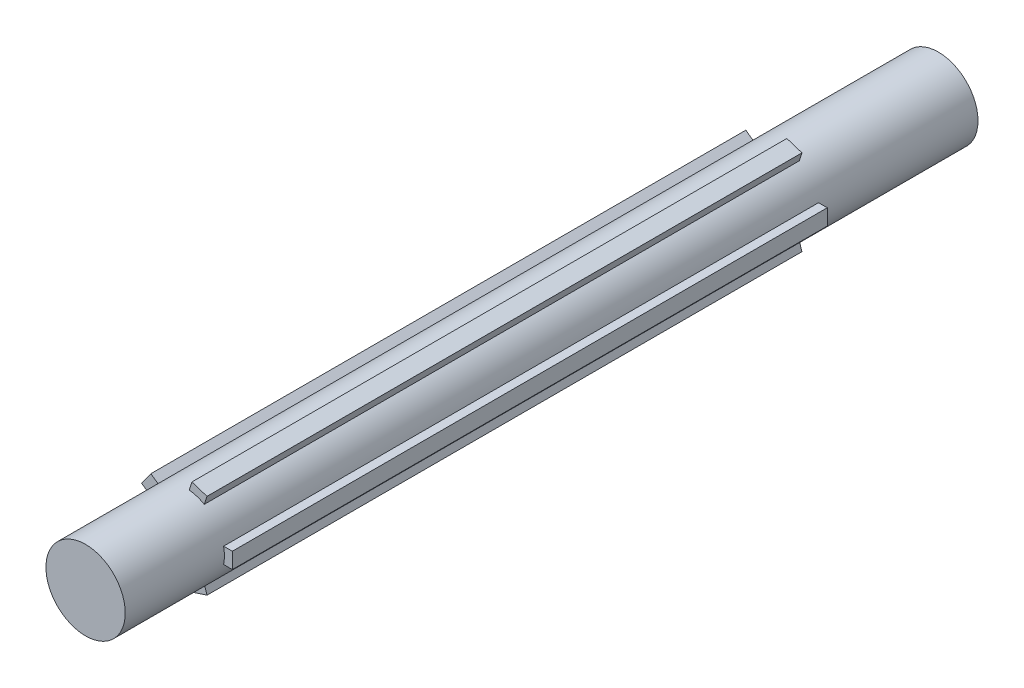
ISO-10303-21;
HEADER;
FILE_DESCRIPTION(('STEP AP214'),'2;1');
FILE_NAME('part.step','',(''),(''),'','','');
FILE_SCHEMA(('AUTOMOTIVE_DESIGN { 1 0 10303 214 1 1 1 1 }'));
ENDSEC;
DATA;
#1=APPLICATION_CONTEXT('core data for automotive mechanical design processes');
#2=APPLICATION_PROTOCOL_DEFINITION('international standard','automotive_design',2000,#1);
#3=PRODUCT_CONTEXT('',#1,'mechanical');
#4=PRODUCT('Part','Part','',(#3));
#5=PRODUCT_RELATED_PRODUCT_CATEGORY('part','',(#4));
#6=PRODUCT_DEFINITION_FORMATION('','',#4);
#7=PRODUCT_DEFINITION_CONTEXT('part definition',#1,'design');
#8=PRODUCT_DEFINITION('design','',#6,#7);
#9=PRODUCT_DEFINITION_SHAPE('','',#8);
#10=(LENGTH_UNIT() NAMED_UNIT(*) SI_UNIT(.MILLI.,.METRE.));
#11=(NAMED_UNIT(*) PLANE_ANGLE_UNIT() SI_UNIT($,.RADIAN.));
#12=(NAMED_UNIT(*) SI_UNIT($,.STERADIAN.) SOLID_ANGLE_UNIT());
#13=UNCERTAINTY_MEASURE_WITH_UNIT(LENGTH_MEASURE(1.E-05),#10,'distance_accuracy_value','');
#14=(GEOMETRIC_REPRESENTATION_CONTEXT(3) GLOBAL_UNCERTAINTY_ASSIGNED_CONTEXT((#13)) GLOBAL_UNIT_ASSIGNED_CONTEXT((#10,
#11,#12)) REPRESENTATION_CONTEXT('',''));
#15=CARTESIAN_POINT('',(0.,0.,0.));
#16=DIRECTION('',(0.,0.,1.));
#17=DIRECTION('',(1.,0.,0.));
#18=AXIS2_PLACEMENT_3D('',#15,#16,#17);
#19=CARTESIAN_POINT('',(0.,0.,-150.));
#20=DIRECTION('',(0.,0.,1.));
#21=DIRECTION('',(1.,0.,0.));
#22=AXIS2_PLACEMENT_3D('',#19,#20,#21);
#23=PLANE('',#22);
#24=CARTESIAN_POINT('',(0.,0.,-150.));
#25=DIRECTION('',(0.,0.,-1.));
#26=DIRECTION('',(-1.,0.,0.));
#27=AXIS2_PLACEMENT_3D('',#24,#25,#26);
#28=CIRCLE('',#27,10.);
#29=CARTESIAN_POINT('',(-9.10228582241994,4.1410617970483,-150.));
#30=VERTEX_POINT('',#29);
#31=CARTESIAN_POINT('',(-6.75114481325018,7.37712977454818,-150.));
#32=VERTEX_POINT('',#31);
#33=EDGE_CURVE('E56',#30,#32,#28,.T.);
#34=ORIENTED_EDGE('',*,*,#33,.F.);
#35=DIRECTION('',(-0.809016994374947,0.587785252292473,0.));
#36=VECTOR('',#35,1.);
#37=CARTESIAN_POINT('',(-9.10228582241994,4.1410617970483,-150.));
#38=LINE('',#37,#36);
#39=CARTESIAN_POINT('',(-10.8837744370843,5.43538903875934,-150.));
#40=VERTEX_POINT('',#39);
#41=EDGE_CURVE('E381',#30,#40,#38,.T.);
#42=ORIENTED_EDGE('',*,*,#41,.T.);
#43=DIRECTION('',(0.587785252292473,0.809016994374948,0.));
#44=VECTOR('',#43,1.);
#45=CARTESIAN_POINT('',(-10.8837744370843,5.43538903875934,-150.));
#46=LINE('',#45,#44);
#47=CARTESIAN_POINT('',(-8.53263342791446,8.67145701625913,-150.));
#48=VERTEX_POINT('',#47);
#49=EDGE_CURVE('E389',#40,#48,#46,.T.);
#50=ORIENTED_EDGE('',*,*,#49,.T.);
#51=DIRECTION('',(-0.809016994374947,0.587785252292473,0.));
#52=VECTOR('',#51,1.);
#53=CARTESIAN_POINT('',(-6.75114481325018,7.37712977454818,-150.));
#54=LINE('',#53,#52);
#55=EDGE_CURVE('E392',#32,#48,#54,.T.);
#56=ORIENTED_EDGE('',*,*,#55,.F.);
#57=EDGE_LOOP('',(#34,#42,#50,#56));
#58=FACE_BOUND('',#57,.T.);
#59=ADVANCED_FACE('F43',(#58),#23,.F.);
#60=CARTESIAN_POINT('',(1.12562279967807,9.93644671463823,-150.));
#61=VERTEX_POINT('',#60);
#62=CARTESIAN_POINT('',(4.9298488648587,8.70037873713848,-150.));
#63=VERTEX_POINT('',#62);
#64=EDGE_CURVE('E11',#61,#63,#28,.T.);
#65=ORIENTED_EDGE('',*,*,#64,.F.);
#66=DIRECTION('',(0.309016994374947,0.951056516295154,0.));
#67=VECTOR('',#66,1.);
#68=CARTESIAN_POINT('',(1.12562279967807,9.93644671463823,-150.));
#69=LINE('',#68,#67);
#70=CARTESIAN_POINT('',(1.80609089990889,12.0307121842915,-150.));
#71=VERTEX_POINT('',#70);
#72=EDGE_CURVE('E179',#61,#71,#69,.T.);
#73=ORIENTED_EDGE('',*,*,#72,.T.);
#74=DIRECTION('',(0.951056516295154,-0.309016994374947,0.));
#75=VECTOR('',#74,1.);
#76=CARTESIAN_POINT('',(1.80609089990889,12.0307121842915,-150.));
#77=LINE('',#76,#75);
#78=CARTESIAN_POINT('',(5.6103169650895,10.7946442067917,-150.));
#79=VERTEX_POINT('',#78);
#80=EDGE_CURVE('E171',#71,#79,#77,.T.);
#81=ORIENTED_EDGE('',*,*,#80,.T.);
#82=DIRECTION('',(0.309016994374947,0.951056516295154,0.));
#83=VECTOR('',#82,1.);
#84=CARTESIAN_POINT('',(4.9298488648587,8.70037873713848,-150.));
#85=LINE('',#84,#83);
#86=EDGE_CURVE('E177',#63,#79,#85,.T.);
#87=ORIENTED_EDGE('',*,*,#86,.F.);
#88=EDGE_LOOP('',(#65,#73,#81,#87));
#89=FACE_BOUND('',#88,.T.);
#90=ADVANCED_FACE('F174',(#89),#23,.F.);
#91=CARTESIAN_POINT('',(9.79795897113271,2.,-150.));
#92=VERTEX_POINT('',#91);
#93=CARTESIAN_POINT('',(9.79795897113271,-2.,-150.));
#94=VERTEX_POINT('',#93);
#95=EDGE_CURVE('E54',#92,#94,#28,.T.);
#96=ORIENTED_EDGE('',*,*,#95,.F.);
#97=DIRECTION('',(1.,0.,0.));
#98=VECTOR('',#97,1.);
#99=CARTESIAN_POINT('',(9.79795897113271,2.,-150.));
#100=LINE('',#99,#98);
#101=CARTESIAN_POINT('',(12.,2.,-150.));
#102=VERTEX_POINT('',#101);
#103=EDGE_CURVE('E201',#92,#102,#100,.T.);
#104=ORIENTED_EDGE('',*,*,#103,.T.);
#105=DIRECTION('',(0.,-1.,0.));
#106=VECTOR('',#105,1.);
#107=CARTESIAN_POINT('',(12.,2.,-150.));
#108=LINE('',#107,#106);
#109=CARTESIAN_POINT('',(12.,-2.,-150.));
#110=VERTEX_POINT('',#109);
#111=EDGE_CURVE('E64',#102,#110,#108,.T.);
#112=ORIENTED_EDGE('',*,*,#111,.T.);
#113=DIRECTION('',(1.,0.,0.));
#114=VECTOR('',#113,1.);
#115=CARTESIAN_POINT('',(9.79795897113271,-2.,-150.));
#116=LINE('',#115,#114);
#117=EDGE_CURVE('E209',#94,#110,#116,.T.);
#118=ORIENTED_EDGE('',*,*,#117,.F.);
#119=EDGE_LOOP('',(#96,#104,#112,#118));
#120=FACE_BOUND('',#119,.T.);
#121=ADVANCED_FACE('F438',(#120),#23,.F.);
#122=CARTESIAN_POINT('',(4.92984886485898,-8.70037873713832,-150.));
#123=VERTEX_POINT('',#122);
#124=CARTESIAN_POINT('',(1.12562279967839,-9.9364467146382,-150.));
#125=VERTEX_POINT('',#124);
#126=EDGE_CURVE('E346',#123,#125,#28,.T.);
#127=ORIENTED_EDGE('',*,*,#126,.F.);
#128=DIRECTION('',(0.309016994374947,-0.951056516295154,0.));
#129=VECTOR('',#128,1.);
#130=CARTESIAN_POINT('',(4.92984886485898,-8.70037873713832,-150.));
#131=LINE('',#130,#129);
#132=CARTESIAN_POINT('',(5.61031696508993,-10.7946442067921,-150.));
#133=VERTEX_POINT('',#132);
#134=EDGE_CURVE('E265',#123,#133,#131,.T.);
#135=ORIENTED_EDGE('',*,*,#134,.T.);
#136=DIRECTION('',(-0.951056516295154,-0.309016994374947,0.));
#137=VECTOR('',#136,1.);
#138=CARTESIAN_POINT('',(5.61031696508993,-10.7946442067921,-150.));
#139=LINE('',#138,#137);
#140=CARTESIAN_POINT('',(1.80609089990932,-12.0307121842918,-150.));
#141=VERTEX_POINT('',#140);
#142=EDGE_CURVE('E144',#133,#141,#139,.T.);
#143=ORIENTED_EDGE('',*,*,#142,.T.);
#144=DIRECTION('',(0.309016994374947,-0.951056516295154,0.));
#145=VECTOR('',#144,1.);
#146=CARTESIAN_POINT('',(1.12562279967839,-9.93644671463819,-150.));
#147=LINE('',#146,#145);
#148=EDGE_CURVE('E383',#125,#141,#147,.T.);
#149=ORIENTED_EDGE('',*,*,#148,.F.);
#150=EDGE_LOOP('',(#127,#135,#143,#149));
#151=FACE_BOUND('',#150,.T.);
#152=ADVANCED_FACE('F440',(#151),#23,.F.);
#153=CARTESIAN_POINT('',(-6.75114481324956,-7.37712977454874,-150.));
#154=VERTEX_POINT('',#153);
#155=CARTESIAN_POINT('',(-9.1022858224196,-4.14106179704906,-150.));
#156=VERTEX_POINT('',#155);
#157=EDGE_CURVE('E340',#154,#156,#28,.T.);
#158=ORIENTED_EDGE('',*,*,#157,.F.);
#159=DIRECTION('',(-0.809016994374947,-0.587785252292473,0.));
#160=VECTOR('',#159,1.);
#161=CARTESIAN_POINT('',(-6.75114481324956,-7.37712977454874,-150.));
#162=LINE('',#161,#160);
#163=CARTESIAN_POINT('',(-8.53263342791419,-8.67145701625995,-150.));
#164=VERTEX_POINT('',#163);
#165=EDGE_CURVE('E377',#154,#164,#162,.T.);
#166=ORIENTED_EDGE('',*,*,#165,.T.);
#167=DIRECTION('',(-0.587785252292473,0.809016994374947,0.));
#168=VECTOR('',#167,1.);
#169=CARTESIAN_POINT('',(-8.53263342791419,-8.67145701625995,-150.));
#170=LINE('',#169,#168);
#171=CARTESIAN_POINT('',(-10.8837744370841,-5.43538903876016,-150.));
#172=VERTEX_POINT('',#171);
#173=EDGE_CURVE('E371',#164,#172,#170,.T.);
#174=ORIENTED_EDGE('',*,*,#173,.T.);
#175=DIRECTION('',(-0.809016994374947,-0.587785252292473,0.));
#176=VECTOR('',#175,1.);
#177=CARTESIAN_POINT('',(-9.10228582241959,-4.14106179704906,-150.));
#178=LINE('',#177,#176);
#179=EDGE_CURVE('E376',#156,#172,#178,.T.);
#180=ORIENTED_EDGE('',*,*,#179,.F.);
#181=EDGE_LOOP('',(#158,#166,#174,#180));
#182=FACE_BOUND('',#181,.T.);
#183=ADVANCED_FACE('F446',(#182),#23,.F.);
#184=CARTESIAN_POINT('',(0.,0.,0.));
#185=DIRECTION('',(0.,0.,1.));
#186=DIRECTION('',(1.,0.,0.));
#187=AXIS2_PLACEMENT_3D('',#184,#185,#186);
#188=PLANE('',#187);
#189=CARTESIAN_POINT('',(0.,0.,0.));
#190=DIRECTION('',(0.,0.,1.));
#191=DIRECTION('',(1.,0.,0.));
#192=AXIS2_PLACEMENT_3D('',#189,#190,#191);
#193=CIRCLE('',#192,10.);
#194=CARTESIAN_POINT('',(4.9298488648587,8.70037873713848,0.));
#195=VERTEX_POINT('',#194);
#196=CARTESIAN_POINT('',(1.12562279967807,9.93644671463823,0.));
#197=VERTEX_POINT('',#196);
#198=EDGE_CURVE('E330',#195,#197,#193,.T.);
#199=ORIENTED_EDGE('',*,*,#198,.F.);
#200=DIRECTION('',(0.309016994374947,0.951056516295154,0.));
#201=VECTOR('',#200,1.);
#202=CARTESIAN_POINT('',(4.9298488648587,8.70037873713848,0.));
#203=LINE('',#202,#201);
#204=CARTESIAN_POINT('',(5.6103169650895,10.7946442067917,0.));
#205=VERTEX_POINT('',#204);
#206=EDGE_CURVE('E252',#195,#205,#203,.T.);
#207=ORIENTED_EDGE('',*,*,#206,.T.);
#208=DIRECTION('',(0.951056516295154,-0.309016994374947,0.));
#209=VECTOR('',#208,1.);
#210=CARTESIAN_POINT('',(1.80609089990889,12.0307121842915,0.));
#211=LINE('',#210,#209);
#212=CARTESIAN_POINT('',(1.80609089990889,12.0307121842915,0.));
#213=VERTEX_POINT('',#212);
#214=EDGE_CURVE('E189',#213,#205,#211,.T.);
#215=ORIENTED_EDGE('',*,*,#214,.F.);
#216=DIRECTION('',(0.309016994374947,0.951056516295154,0.));
#217=VECTOR('',#216,1.);
#218=CARTESIAN_POINT('',(1.12562279967807,9.93644671463823,0.));
#219=LINE('',#218,#217);
#220=EDGE_CURVE('E247',#197,#213,#219,.T.);
#221=ORIENTED_EDGE('',*,*,#220,.F.);
#222=EDGE_LOOP('',(#199,#207,#215,#221));
#223=FACE_BOUND('',#222,.T.);
#224=ADVANCED_FACE('F454',(#223),#188,.T.);
#225=CARTESIAN_POINT('',(-6.75114481325018,7.37712977454818,0.));
#226=VERTEX_POINT('',#225);
#227=CARTESIAN_POINT('',(-9.10228582241994,4.1410617970483,0.));
#228=VERTEX_POINT('',#227);
#229=EDGE_CURVE('E341',#226,#228,#193,.T.);
#230=ORIENTED_EDGE('',*,*,#229,.F.);
#231=DIRECTION('',(-0.809016994374947,0.587785252292473,0.));
#232=VECTOR('',#231,1.);
#233=CARTESIAN_POINT('',(-6.75114481325018,7.37712977454818,0.));
#234=LINE('',#233,#232);
#235=CARTESIAN_POINT('',(-8.53263342791446,8.67145701625913,0.));
#236=VERTEX_POINT('',#235);
#237=EDGE_CURVE('E243',#226,#236,#234,.T.);
#238=ORIENTED_EDGE('',*,*,#237,.T.);
#239=DIRECTION('',(0.587785252292473,0.809016994374948,0.));
#240=VECTOR('',#239,1.);
#241=CARTESIAN_POINT('',(-10.8837744370843,5.43538903875934,0.));
#242=LINE('',#241,#240);
#243=CARTESIAN_POINT('',(-10.8837744370843,5.43538903875934,0.));
#244=VERTEX_POINT('',#243);
#245=EDGE_CURVE('E239',#244,#236,#242,.T.);
#246=ORIENTED_EDGE('',*,*,#245,.F.);
#247=DIRECTION('',(-0.809016994374947,0.587785252292473,0.));
#248=VECTOR('',#247,1.);
#249=CARTESIAN_POINT('',(-9.10228582241994,4.1410617970483,0.));
#250=LINE('',#249,#248);
#251=EDGE_CURVE('E236',#228,#244,#250,.T.);
#252=ORIENTED_EDGE('',*,*,#251,.F.);
#253=EDGE_LOOP('',(#230,#238,#246,#252));
#254=FACE_BOUND('',#253,.T.);
#255=ADVANCED_FACE('F458',(#254),#188,.T.);
#256=CARTESIAN_POINT('',(-9.1022858224196,-4.14106179704906,0.));
#257=VERTEX_POINT('',#256);
#258=CARTESIAN_POINT('',(-6.75114481324956,-7.37712977454874,0.));
#259=VERTEX_POINT('',#258);
#260=EDGE_CURVE('E335',#257,#259,#193,.T.);
#261=ORIENTED_EDGE('',*,*,#260,.F.);
#262=DIRECTION('',(-0.809016994374947,-0.587785252292473,0.));
#263=VECTOR('',#262,1.);
#264=CARTESIAN_POINT('',(-9.10228582241959,-4.14106179704906,0.));
#265=LINE('',#264,#263);
#266=CARTESIAN_POINT('',(-10.8837744370841,-5.43538903876016,0.));
#267=VERTEX_POINT('',#266);
#268=EDGE_CURVE('E232',#257,#267,#265,.T.);
#269=ORIENTED_EDGE('',*,*,#268,.T.);
#270=DIRECTION('',(-0.587785252292473,0.809016994374947,0.));
#271=VECTOR('',#270,1.);
#272=CARTESIAN_POINT('',(-8.53263342791419,-8.67145701625995,0.));
#273=LINE('',#272,#271);
#274=CARTESIAN_POINT('',(-8.53263342791419,-8.67145701625995,0.));
#275=VERTEX_POINT('',#274);
#276=EDGE_CURVE('E228',#275,#267,#273,.T.);
#277=ORIENTED_EDGE('',*,*,#276,.F.);
#278=DIRECTION('',(-0.809016994374947,-0.587785252292473,0.));
#279=VECTOR('',#278,1.);
#280=CARTESIAN_POINT('',(-6.75114481324956,-7.37712977454874,0.));
#281=LINE('',#280,#279);
#282=EDGE_CURVE('E225',#259,#275,#281,.T.);
#283=ORIENTED_EDGE('',*,*,#282,.F.);
#284=EDGE_LOOP('',(#261,#269,#277,#283));
#285=FACE_BOUND('',#284,.T.);
#286=ADVANCED_FACE('F362',(#285),#188,.T.);
#287=CARTESIAN_POINT('',(1.12562279967838,-9.93644671463819,0.));
#288=VERTEX_POINT('',#287);
#289=CARTESIAN_POINT('',(4.92984886485898,-8.70037873713833,0.));
#290=VERTEX_POINT('',#289);
#291=EDGE_CURVE('E328',#288,#290,#193,.T.);
#292=ORIENTED_EDGE('',*,*,#291,.F.);
#293=DIRECTION('',(0.309016994374947,-0.951056516295154,0.));
#294=VECTOR('',#293,1.);
#295=CARTESIAN_POINT('',(1.12562279967839,-9.93644671463819,0.));
#296=LINE('',#295,#294);
#297=CARTESIAN_POINT('',(1.80609089990932,-12.0307121842918,0.));
#298=VERTEX_POINT('',#297);
#299=EDGE_CURVE('E221',#288,#298,#296,.T.);
#300=ORIENTED_EDGE('',*,*,#299,.T.);
#301=DIRECTION('',(-0.951056516295154,-0.309016994374947,0.));
#302=VECTOR('',#301,1.);
#303=CARTESIAN_POINT('',(5.61031696508993,-10.7946442067921,0.));
#304=LINE('',#303,#302);
#305=CARTESIAN_POINT('',(5.61031696508993,-10.7946442067921,0.));
#306=VERTEX_POINT('',#305);
#307=EDGE_CURVE('E216',#306,#298,#304,.T.);
#308=ORIENTED_EDGE('',*,*,#307,.F.);
#309=DIRECTION('',(0.309016994374947,-0.951056516295154,0.));
#310=VECTOR('',#309,1.);
#311=CARTESIAN_POINT('',(4.92984886485898,-8.70037873713832,0.));
#312=LINE('',#311,#310);
#313=EDGE_CURVE('E213',#290,#306,#312,.T.);
#314=ORIENTED_EDGE('',*,*,#313,.F.);
#315=EDGE_LOOP('',(#292,#300,#308,#314));
#316=FACE_BOUND('',#315,.T.);
#317=ADVANCED_FACE('F467',(#316),#188,.T.);
#318=CARTESIAN_POINT('',(4.92984886485898,-8.70037873713832,-150.));
#319=DIRECTION('',(-0.951056516295154,-0.309016994374947,0.));
#320=DIRECTION('',(0.309016994374947,-0.951056516295154,0.));
#321=AXIS2_PLACEMENT_3D('',#318,#319,#320);
#322=PLANE('',#321);
#323=ORIENTED_EDGE('',*,*,#313,.T.);
#324=DIRECTION('',(0.,0.,1.));
#325=VECTOR('',#324,1.);
#326=CARTESIAN_POINT('',(5.61031696508993,-10.7946442067921,-150.));
#327=LINE('',#326,#325);
#328=EDGE_CURVE('E47',#133,#306,#327,.T.);
#329=ORIENTED_EDGE('',*,*,#328,.F.);
#330=ORIENTED_EDGE('',*,*,#134,.F.);
#331=DIRECTION('',(0.,0.,1.));
#332=VECTOR('',#331,1.);
#333=CARTESIAN_POINT('',(4.92984886485898,-8.70037873713833,-150.));
#334=LINE('',#333,#332);
#335=EDGE_CURVE('E135',#123,#290,#334,.T.);
#336=ORIENTED_EDGE('',*,*,#335,.T.);
#337=EDGE_LOOP('',(#323,#329,#330,#336));
#338=FACE_BOUND('',#337,.T.);
#339=ADVANCED_FACE('F45',(#338),#322,.F.);
#340=CARTESIAN_POINT('',(5.61031696508993,-10.7946442067921,-150.));
#341=DIRECTION('',(-0.309016994374947,0.951056516295153,0.));
#342=DIRECTION('',(-0.951056516295154,-0.309016994374948,0.));
#343=AXIS2_PLACEMENT_3D('',#340,#341,#342);
#344=PLANE('',#343);
#345=ORIENTED_EDGE('',*,*,#307,.T.);
#346=DIRECTION('',(0.,0.,1.));
#347=VECTOR('',#346,1.);
#348=CARTESIAN_POINT('',(1.80609089990932,-12.0307121842918,-150.));
#349=LINE('',#348,#347);
#350=EDGE_CURVE('E320',#141,#298,#349,.T.);
#351=ORIENTED_EDGE('',*,*,#350,.F.);
#352=ORIENTED_EDGE('',*,*,#142,.F.);
#353=ORIENTED_EDGE('',*,*,#328,.T.);
#354=EDGE_LOOP('',(#345,#351,#352,#353));
#355=FACE_BOUND('',#354,.T.);
#356=ADVANCED_FACE('F480',(#355),#344,.F.);
#357=CARTESIAN_POINT('',(1.12562279967839,-9.93644671463819,-150.));
#358=DIRECTION('',(-0.951056516295154,-0.309016994374947,0.));
#359=DIRECTION('',(0.309016994374947,-0.951056516295154,0.));
#360=AXIS2_PLACEMENT_3D('',#357,#358,#359);
#361=PLANE('',#360);
#362=ORIENTED_EDGE('',*,*,#299,.F.);
#363=DIRECTION('',(0.,0.,1.));
#364=VECTOR('',#363,1.);
#365=CARTESIAN_POINT('',(1.12562279967838,-9.93644671463819,-150.));
#366=LINE('',#365,#364);
#367=EDGE_CURVE('E317',#125,#288,#366,.T.);
#368=ORIENTED_EDGE('',*,*,#367,.F.);
#369=ORIENTED_EDGE('',*,*,#148,.T.);
#370=ORIENTED_EDGE('',*,*,#350,.T.);
#371=EDGE_LOOP('',(#362,#368,#369,#370));
#372=FACE_BOUND('',#371,.T.);
#373=ADVANCED_FACE('F483',(#372),#361,.T.);
#374=CARTESIAN_POINT('',(-6.75114481324956,-7.37712977454874,-150.));
#375=DIRECTION('',(-0.587785252292473,0.809016994374947,0.));
#376=DIRECTION('',(-0.809016994374947,-0.587785252292473,0.));
#377=AXIS2_PLACEMENT_3D('',#374,#375,#376);
#378=PLANE('',#377);
#379=ORIENTED_EDGE('',*,*,#282,.T.);
#380=DIRECTION('',(0.,0.,1.));
#381=VECTOR('',#380,1.);
#382=CARTESIAN_POINT('',(-8.53263342791419,-8.67145701625995,-150.));
#383=LINE('',#382,#381);
#384=EDGE_CURVE('E310',#164,#275,#383,.T.);
#385=ORIENTED_EDGE('',*,*,#384,.F.);
#386=ORIENTED_EDGE('',*,*,#165,.F.);
#387=DIRECTION('',(0.,0.,1.));
#388=VECTOR('',#387,1.);
#389=CARTESIAN_POINT('',(-6.75114481324956,-7.37712977454874,-150.));
#390=LINE('',#389,#388);
#391=EDGE_CURVE('E314',#154,#259,#390,.T.);
#392=ORIENTED_EDGE('',*,*,#391,.T.);
#393=EDGE_LOOP('',(#379,#385,#386,#392));
#394=FACE_BOUND('',#393,.T.);
#395=ADVANCED_FACE('F366',(#394),#378,.F.);
#396=CARTESIAN_POINT('',(-8.53263342791419,-8.67145701625995,-150.));
#397=DIRECTION('',(0.809016994374947,0.587785252292473,0.));
#398=DIRECTION('',(-0.587785252292473,0.809016994374947,0.));
#399=AXIS2_PLACEMENT_3D('',#396,#397,#398);
#400=PLANE('',#399);
#401=ORIENTED_EDGE('',*,*,#276,.T.);
#402=DIRECTION('',(0.,0.,1.));
#403=VECTOR('',#402,1.);
#404=CARTESIAN_POINT('',(-10.8837744370841,-5.43538903876016,-150.));
#405=LINE('',#404,#403);
#406=EDGE_CURVE('E307',#172,#267,#405,.T.);
#407=ORIENTED_EDGE('',*,*,#406,.F.);
#408=ORIENTED_EDGE('',*,*,#173,.F.);
#409=ORIENTED_EDGE('',*,*,#384,.T.);
#410=EDGE_LOOP('',(#401,#407,#408,#409));
#411=FACE_BOUND('',#410,.T.);
#412=ADVANCED_FACE('F369',(#411),#400,.F.);
#413=CARTESIAN_POINT('',(-9.10228582241959,-4.14106179704906,-150.));
#414=DIRECTION('',(-0.587785252292473,0.809016994374947,0.));
#415=DIRECTION('',(-0.809016994374947,-0.587785252292473,0.));
#416=AXIS2_PLACEMENT_3D('',#413,#414,#415);
#417=PLANE('',#416);
#418=ORIENTED_EDGE('',*,*,#268,.F.);
#419=DIRECTION('',(0.,0.,1.));
#420=VECTOR('',#419,1.);
#421=CARTESIAN_POINT('',(-9.1022858224196,-4.14106179704906,-150.));
#422=LINE('',#421,#420);
#423=EDGE_CURVE('E303',#156,#257,#422,.T.);
#424=ORIENTED_EDGE('',*,*,#423,.F.);
#425=ORIENTED_EDGE('',*,*,#179,.T.);
#426=ORIENTED_EDGE('',*,*,#406,.T.);
#427=EDGE_LOOP('',(#418,#424,#425,#426));
#428=FACE_BOUND('',#427,.T.);
#429=ADVANCED_FACE('F494',(#428),#417,.T.);
#430=CARTESIAN_POINT('',(-9.10228582241994,4.1410617970483,-150.));
#431=DIRECTION('',(0.587785252292473,0.809016994374947,0.));
#432=DIRECTION('',(-0.809016994374947,0.587785252292473,0.));
#433=AXIS2_PLACEMENT_3D('',#430,#431,#432);
#434=PLANE('',#433);
#435=ORIENTED_EDGE('',*,*,#251,.T.);
#436=DIRECTION('',(0.,0.,1.));
#437=VECTOR('',#436,1.);
#438=CARTESIAN_POINT('',(-10.8837744370843,5.43538903875934,-150.));
#439=LINE('',#438,#437);
#440=EDGE_CURVE('E296',#40,#244,#439,.T.);
#441=ORIENTED_EDGE('',*,*,#440,.F.);
#442=ORIENTED_EDGE('',*,*,#41,.F.);
#443=DIRECTION('',(0.,0.,1.));
#444=VECTOR('',#443,1.);
#445=CARTESIAN_POINT('',(-9.10228582241994,4.1410617970483,-150.));
#446=LINE('',#445,#444);
#447=EDGE_CURVE('E300',#30,#228,#446,.T.);
#448=ORIENTED_EDGE('',*,*,#447,.T.);
#449=EDGE_LOOP('',(#435,#441,#442,#448));
#450=FACE_BOUND('',#449,.T.);
#451=ADVANCED_FACE('F497',(#450),#434,.F.);
#452=CARTESIAN_POINT('',(-10.8837744370843,5.43538903875934,-150.));
#453=DIRECTION('',(0.809016994374948,-0.587785252292473,0.));
#454=DIRECTION('',(0.587785252292473,0.809016994374948,0.));
#455=AXIS2_PLACEMENT_3D('',#452,#453,#454);
#456=PLANE('',#455);
#457=ORIENTED_EDGE('',*,*,#245,.T.);
#458=DIRECTION('',(0.,0.,1.));
#459=VECTOR('',#458,1.);
#460=CARTESIAN_POINT('',(-8.53263342791446,8.67145701625913,-150.));
#461=LINE('',#460,#459);
#462=EDGE_CURVE('E293',#48,#236,#461,.T.);
#463=ORIENTED_EDGE('',*,*,#462,.F.);
#464=ORIENTED_EDGE('',*,*,#49,.F.);
#465=ORIENTED_EDGE('',*,*,#440,.T.);
#466=EDGE_LOOP('',(#457,#463,#464,#465));
#467=FACE_BOUND('',#466,.T.);
#468=ADVANCED_FACE('F501',(#467),#456,.F.);
#469=CARTESIAN_POINT('',(-6.75114481325018,7.37712977454818,-150.));
#470=DIRECTION('',(0.587785252292473,0.809016994374948,0.));
#471=DIRECTION('',(-0.809016994374948,0.587785252292473,0.));
#472=AXIS2_PLACEMENT_3D('',#469,#470,#471);
#473=PLANE('',#472);
#474=ORIENTED_EDGE('',*,*,#237,.F.);
#475=DIRECTION('',(0.,0.,1.));
#476=VECTOR('',#475,1.);
#477=CARTESIAN_POINT('',(-6.75114481325018,7.37712977454818,-150.));
#478=LINE('',#477,#476);
#479=EDGE_CURVE('E289',#32,#226,#478,.T.);
#480=ORIENTED_EDGE('',*,*,#479,.F.);
#481=ORIENTED_EDGE('',*,*,#55,.T.);
#482=ORIENTED_EDGE('',*,*,#462,.T.);
#483=EDGE_LOOP('',(#474,#480,#481,#482));
#484=FACE_BOUND('',#483,.T.);
#485=ADVANCED_FACE('F400',(#484),#473,.T.);
#486=CARTESIAN_POINT('',(1.12562279967807,9.93644671463823,-150.));
#487=DIRECTION('',(0.951056516295154,-0.309016994374947,0.));
#488=DIRECTION('',(0.309016994374947,0.951056516295154,0.));
#489=AXIS2_PLACEMENT_3D('',#486,#487,#488);
#490=PLANE('',#489);
#491=ORIENTED_EDGE('',*,*,#220,.T.);
#492=DIRECTION('',(0.,0.,1.));
#493=VECTOR('',#492,1.);
#494=CARTESIAN_POINT('',(1.80609089990889,12.0307121842915,-150.));
#495=LINE('',#494,#493);
#496=EDGE_CURVE('E194',#71,#213,#495,.T.);
#497=ORIENTED_EDGE('',*,*,#496,.F.);
#498=ORIENTED_EDGE('',*,*,#72,.F.);
#499=DIRECTION('',(0.,0.,1.));
#500=VECTOR('',#499,1.);
#501=CARTESIAN_POINT('',(1.12562279967807,9.93644671463823,-150.));
#502=LINE('',#501,#500);
#503=EDGE_CURVE('E286',#61,#197,#502,.T.);
#504=ORIENTED_EDGE('',*,*,#503,.T.);
#505=EDGE_LOOP('',(#491,#497,#498,#504));
#506=FACE_BOUND('',#505,.T.);
#507=ADVANCED_FACE('F508',(#506),#490,.F.);
#508=CARTESIAN_POINT('',(1.80609089990889,12.0307121842915,-150.));
#509=DIRECTION('',(-0.309016994374947,-0.951056516295154,0.));
#510=DIRECTION('',(0.951056516295154,-0.309016994374947,0.));
#511=AXIS2_PLACEMENT_3D('',#508,#509,#510);
#512=PLANE('',#511);
#513=ORIENTED_EDGE('',*,*,#214,.T.);
#514=DIRECTION('',(0.,0.,1.));
#515=VECTOR('',#514,1.);
#516=CARTESIAN_POINT('',(5.6103169650895,10.7946442067917,-150.));
#517=LINE('',#516,#515);
#518=EDGE_CURVE('E186',#79,#205,#517,.T.);
#519=ORIENTED_EDGE('',*,*,#518,.F.);
#520=ORIENTED_EDGE('',*,*,#80,.F.);
#521=ORIENTED_EDGE('',*,*,#496,.T.);
#522=EDGE_LOOP('',(#513,#519,#520,#521));
#523=FACE_BOUND('',#522,.T.);
#524=ADVANCED_FACE('F187',(#523),#512,.F.);
#525=CARTESIAN_POINT('',(4.9298488648587,8.70037873713848,-150.));
#526=DIRECTION('',(0.951056516295154,-0.309016994374947,0.));
#527=DIRECTION('',(0.309016994374947,0.951056516295154,0.));
#528=AXIS2_PLACEMENT_3D('',#525,#526,#527);
#529=PLANE('',#528);
#530=ORIENTED_EDGE('',*,*,#206,.F.);
#531=DIRECTION('',(0.,0.,1.));
#532=VECTOR('',#531,1.);
#533=CARTESIAN_POINT('',(4.9298488648587,8.70037873713848,-150.));
#534=LINE('',#533,#532);
#535=EDGE_CURVE('E195',#63,#195,#534,.T.);
#536=ORIENTED_EDGE('',*,*,#535,.F.);
#537=ORIENTED_EDGE('',*,*,#86,.T.);
#538=ORIENTED_EDGE('',*,*,#518,.T.);
#539=EDGE_LOOP('',(#530,#536,#537,#538));
#540=FACE_BOUND('',#539,.T.);
#541=ADVANCED_FACE('F198',(#540),#529,.T.);
#542=CARTESIAN_POINT('',(9.79795897113271,2.,-150.));
#543=DIRECTION('',(0.,-1.,0.));
#544=DIRECTION('',(1.,0.,0.));
#545=AXIS2_PLACEMENT_3D('',#542,#543,#544);
#546=PLANE('',#545);
#547=DIRECTION('',(1.,0.,0.));
#548=VECTOR('',#547,1.);
#549=CARTESIAN_POINT('',(9.79795897113271,2.,0.));
#550=LINE('',#549,#548);
#551=CARTESIAN_POINT('',(9.79795897113271,2.,0.));
#552=VERTEX_POINT('',#551);
#553=CARTESIAN_POINT('',(12.,2.,0.));
#554=VERTEX_POINT('',#553);
#555=EDGE_CURVE('E255',#552,#554,#550,.T.);
#556=ORIENTED_EDGE('',*,*,#555,.T.);
#557=DIRECTION('',(0.,0.,1.));
#558=VECTOR('',#557,1.);
#559=CARTESIAN_POINT('',(12.,2.,-150.));
#560=LINE('',#559,#558);
#561=EDGE_CURVE('E274',#102,#554,#560,.T.);
#562=ORIENTED_EDGE('',*,*,#561,.F.);
#563=ORIENTED_EDGE('',*,*,#103,.F.);
#564=DIRECTION('',(0.,0.,1.));
#565=VECTOR('',#564,1.);
#566=CARTESIAN_POINT('',(9.79795897113271,2.,-150.));
#567=LINE('',#566,#565);
#568=EDGE_CURVE('E278',#92,#552,#567,.T.);
#569=ORIENTED_EDGE('',*,*,#568,.T.);
#570=EDGE_LOOP('',(#556,#562,#563,#569));
#571=FACE_BOUND('',#570,.T.);
#572=ADVANCED_FACE('F431',(#571),#546,.F.);
#573=CARTESIAN_POINT('',(12.,2.,-150.));
#574=DIRECTION('',(-1.,0.,0.));
#575=DIRECTION('',(0.,-1.,0.));
#576=AXIS2_PLACEMENT_3D('',#573,#574,#575);
#577=PLANE('',#576);
#578=DIRECTION('',(0.,-1.,0.));
#579=VECTOR('',#578,1.);
#580=CARTESIAN_POINT('',(12.,2.,0.));
#581=LINE('',#580,#579);
#582=CARTESIAN_POINT('',(12.,-2.,0.));
#583=VERTEX_POINT('',#582);
#584=EDGE_CURVE('E258',#554,#583,#581,.T.);
#585=ORIENTED_EDGE('',*,*,#584,.T.);
#586=DIRECTION('',(0.,0.,1.));
#587=VECTOR('',#586,1.);
#588=CARTESIAN_POINT('',(12.,-2.,-150.));
#589=LINE('',#588,#587);
#590=EDGE_CURVE('E271',#110,#583,#589,.T.);
#591=ORIENTED_EDGE('',*,*,#590,.F.);
#592=ORIENTED_EDGE('',*,*,#111,.F.);
#593=ORIENTED_EDGE('',*,*,#561,.T.);
#594=EDGE_LOOP('',(#585,#591,#592,#593));
#595=FACE_BOUND('',#594,.T.);
#596=ADVANCED_FACE('F518',(#595),#577,.F.);
#597=CARTESIAN_POINT('',(9.79795897113271,-2.,-150.));
#598=DIRECTION('',(0.,-1.,0.));
#599=DIRECTION('',(1.,0.,0.));
#600=AXIS2_PLACEMENT_3D('',#597,#598,#599);
#601=PLANE('',#600);
#602=DIRECTION('',(1.,0.,0.));
#603=VECTOR('',#602,1.);
#604=CARTESIAN_POINT('',(9.79795897113271,-2.,0.));
#605=LINE('',#604,#603);
#606=CARTESIAN_POINT('',(9.79795897113271,-2.,0.));
#607=VERTEX_POINT('',#606);
#608=EDGE_CURVE('E262',#607,#583,#605,.T.);
#609=ORIENTED_EDGE('',*,*,#608,.F.);
#610=DIRECTION('',(0.,0.,1.));
#611=VECTOR('',#610,1.);
#612=CARTESIAN_POINT('',(9.79795897113271,-2.,-150.));
#613=LINE('',#612,#611);
#614=EDGE_CURVE('E268',#94,#607,#613,.T.);
#615=ORIENTED_EDGE('',*,*,#614,.F.);
#616=ORIENTED_EDGE('',*,*,#117,.T.);
#617=ORIENTED_EDGE('',*,*,#590,.T.);
#618=EDGE_LOOP('',(#609,#615,#616,#617));
#619=FACE_BOUND('',#618,.T.);
#620=ADVANCED_FACE('F437',(#619),#601,.T.);
#621=CARTESIAN_POINT('',(0.,0.,-150.));
#622=DIRECTION('',(0.,0.,1.));
#623=DIRECTION('',(1.,0.,0.));
#624=AXIS2_PLACEMENT_3D('',#621,#622,#623);
#625=CYLINDRICAL_SURFACE('',#624,10.);
#626=ORIENTED_EDGE('',*,*,#33,.T.);
#627=ORIENTED_EDGE('',*,*,#479,.T.);
#628=ORIENTED_EDGE('',*,*,#229,.T.);
#629=ORIENTED_EDGE('',*,*,#447,.F.);
#630=EDGE_LOOP('',(#626,#627,#628,#629));
#631=FACE_BOUND('',#630,.T.);
#632=ORIENTED_EDGE('',*,*,#64,.T.);
#633=ORIENTED_EDGE('',*,*,#535,.T.);
#634=ORIENTED_EDGE('',*,*,#198,.T.);
#635=ORIENTED_EDGE('',*,*,#503,.F.);
#636=EDGE_LOOP('',(#632,#633,#634,#635));
#637=FACE_BOUND('',#636,.T.);
#638=ORIENTED_EDGE('',*,*,#95,.T.);
#639=ORIENTED_EDGE('',*,*,#614,.T.);
#640=EDGE_CURVE('E127',#607,#552,#193,.T.);
#641=ORIENTED_EDGE('',*,*,#640,.T.);
#642=ORIENTED_EDGE('',*,*,#568,.F.);
#643=EDGE_LOOP('',(#638,#639,#641,#642));
#644=FACE_BOUND('',#643,.T.);
#645=ORIENTED_EDGE('',*,*,#126,.T.);
#646=ORIENTED_EDGE('',*,*,#367,.T.);
#647=ORIENTED_EDGE('',*,*,#291,.T.);
#648=ORIENTED_EDGE('',*,*,#335,.F.);
#649=EDGE_LOOP('',(#645,#646,#647,#648));
#650=FACE_BOUND('',#649,.T.);
#651=ORIENTED_EDGE('',*,*,#391,.F.);
#652=ORIENTED_EDGE('',*,*,#157,.T.);
#653=ORIENTED_EDGE('',*,*,#423,.T.);
#654=ORIENTED_EDGE('',*,*,#260,.T.);
#655=EDGE_LOOP('',(#651,#652,#653,#654));
#656=FACE_BOUND('',#655,.T.);
#657=CARTESIAN_POINT('',(0.,0.,25.));
#658=DIRECTION('',(0.,0.,1.));
#659=DIRECTION('',(1.,0.,0.));
#660=AXIS2_PLACEMENT_3D('',#657,#658,#659);
#661=CIRCLE('',#660,10.);
#662=CARTESIAN_POINT('',(10.,0.,25.));
#663=VERTEX_POINT('',#662);
#664=EDGE_CURVE('E217',#663,#663,#661,.T.);
#665=ORIENTED_EDGE('',*,*,#664,.F.);
#666=EDGE_LOOP('',(#665));
#667=FACE_BOUND('',#666,.T.);
#668=CARTESIAN_POINT('',(0.,0.,-190.));
#669=DIRECTION('',(0.,0.,-1.));
#670=DIRECTION('',(-1.,0.,0.));
#671=AXIS2_PLACEMENT_3D('',#668,#669,#670);
#672=CIRCLE('',#671,10.);
#673=CARTESIAN_POINT('',(-10.,0.,-190.));
#674=VERTEX_POINT('',#673);
#675=EDGE_CURVE('E756',#674,#674,#672,.T.);
#676=ORIENTED_EDGE('',*,*,#675,.F.);
#677=EDGE_LOOP('',(#676));
#678=FACE_BOUND('',#677,.T.);
#679=ADVANCED_FACE('F354',(#631,#637,#644,#650,#656,#667,#678),#625,.T.);
#680=ORIENTED_EDGE('',*,*,#640,.F.);
#681=ORIENTED_EDGE('',*,*,#608,.T.);
#682=ORIENTED_EDGE('',*,*,#584,.F.);
#683=ORIENTED_EDGE('',*,*,#555,.F.);
#684=EDGE_LOOP('',(#680,#681,#682,#683));
#685=FACE_BOUND('',#684,.T.);
#686=ADVANCED_FACE('F427',(#685),#188,.T.);
#687=CARTESIAN_POINT('',(0.,0.,25.));
#688=DIRECTION('',(0.,0.,1.));
#689=DIRECTION('',(1.,0.,0.));
#690=AXIS2_PLACEMENT_3D('',#687,#688,#689);
#691=PLANE('',#690);
#692=ORIENTED_EDGE('',*,*,#664,.T.);
#693=EDGE_LOOP('',(#692));
#694=FACE_BOUND('',#693,.T.);
#695=ADVANCED_FACE('F466',(#694),#691,.T.);
#696=CARTESIAN_POINT('',(0.,0.,-190.));
#697=DIRECTION('',(0.,0.,-1.));
#698=DIRECTION('',(-1.,0.,0.));
#699=AXIS2_PLACEMENT_3D('',#696,#697,#698);
#700=PLANE('',#699);
#701=ORIENTED_EDGE('',*,*,#675,.T.);
#702=EDGE_LOOP('',(#701));
#703=FACE_BOUND('',#702,.T.);
#704=ADVANCED_FACE('F472',(#703),#700,.T.);
#705=CLOSED_SHELL('',(#59,#90,#121,#152,#183,#224,#255,#286,#317,#339,#356,#373,#395,#412,#429,
#451,#468,#485,#507,#524,#541,#572,#596,#620,#679,#686,#695,#704));
#706=MANIFOLD_SOLID_BREP('B2',#705);
#707=ADVANCED_BREP_SHAPE_REPRESENTATION('',(#18,#706),#14);
#708=SHAPE_DEFINITION_REPRESENTATION(#9,#707);
ENDSEC;
END-ISO-10303-21;
